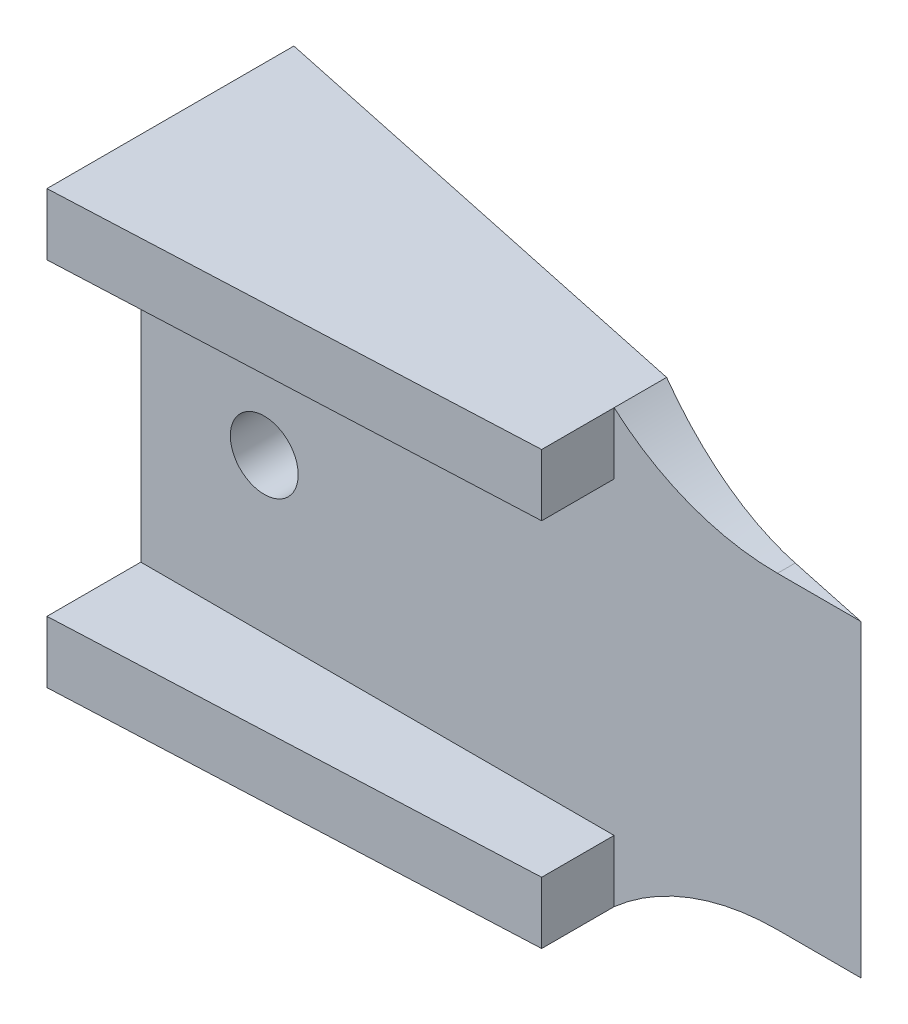
ISO-10303-21;
HEADER;
FILE_DESCRIPTION(('STEP AP214'),'2;1');
FILE_NAME('part.step','',(''),(''),'','','');
FILE_SCHEMA(('AUTOMOTIVE_DESIGN { 1 0 10303 214 1 1 1 1 }'));
ENDSEC;
DATA;
#1=APPLICATION_CONTEXT('core data for automotive mechanical design processes');
#2=APPLICATION_PROTOCOL_DEFINITION('international standard','automotive_design',2000,#1);
#3=PRODUCT_CONTEXT('',#1,'mechanical');
#4=PRODUCT('Part','Part','',(#3));
#5=PRODUCT_RELATED_PRODUCT_CATEGORY('part','',(#4));
#6=PRODUCT_DEFINITION_FORMATION('','',#4);
#7=PRODUCT_DEFINITION_CONTEXT('part definition',#1,'design');
#8=PRODUCT_DEFINITION('design','',#6,#7);
#9=PRODUCT_DEFINITION_SHAPE('','',#8);
#10=(LENGTH_UNIT() NAMED_UNIT(*) SI_UNIT(.MILLI.,.METRE.));
#11=(NAMED_UNIT(*) PLANE_ANGLE_UNIT() SI_UNIT($,.RADIAN.));
#12=(NAMED_UNIT(*) SI_UNIT($,.STERADIAN.) SOLID_ANGLE_UNIT());
#13=UNCERTAINTY_MEASURE_WITH_UNIT(LENGTH_MEASURE(1.E-05),#10,'distance_accuracy_value','');
#14=(GEOMETRIC_REPRESENTATION_CONTEXT(3) GLOBAL_UNCERTAINTY_ASSIGNED_CONTEXT((#13)) GLOBAL_UNIT_ASSIGNED_CONTEXT((#10,
#11,#12)) REPRESENTATION_CONTEXT('',''));
#15=CARTESIAN_POINT('',(0.,0.,0.));
#16=DIRECTION('',(0.,0.,1.));
#17=DIRECTION('',(1.,0.,0.));
#18=AXIS2_PLACEMENT_3D('',#15,#16,#17);
#19=CARTESIAN_POINT('',(0.,0.,0.));
#20=DIRECTION('',(0.,-1.,0.));
#21=DIRECTION('',(0.,0.,-1.));
#22=AXIS2_PLACEMENT_3D('',#19,#20,#21);
#23=PLANE('',#22);
#24=DIRECTION('',(1.,0.,0.));
#25=VECTOR('',#24,1.);
#26=CARTESIAN_POINT('',(0.,0.,0.));
#27=LINE('',#26,#25);
#28=CARTESIAN_POINT('',(30.9372539331938,0.,0.));
#29=VERTEX_POINT('',#28);
#30=CARTESIAN_POINT('',(35.,0.,0.));
#31=VERTEX_POINT('',#30);
#32=EDGE_CURVE('E218',#29,#31,#27,.T.);
#33=ORIENTED_EDGE('',*,*,#32,.F.);
#34=DIRECTION('',(0.,0.,1.));
#35=VECTOR('',#34,1.);
#36=CARTESIAN_POINT('',(30.9372539331938,0.,-2.55067874004027));
#37=LINE('',#36,#35);
#38=CARTESIAN_POINT('',(30.9372539331938,0.,-0.86356333489874));
#39=VERTEX_POINT('',#38);
#40=EDGE_CURVE('E243',#29,#39,#37,.F.);
#41=ORIENTED_EDGE('',*,*,#40,.T.);
#42=DIRECTION('',(-0.978147600733806,0.,-0.20791169081776));
#43=VECTOR('',#42,1.);
#44=CARTESIAN_POINT('',(0.,0.,-7.43947965845079));
#45=LINE('',#44,#43);
#46=EDGE_CURVE('E142',#31,#39,#45,.T.);
#47=ORIENTED_EDGE('',*,*,#46,.F.);
#48=EDGE_LOOP('',(#33,#41,#47));
#49=FACE_BOUND('',#48,.T.);
#50=ADVANCED_FACE('F34',(#49),#23,.T.);
#51=CARTESIAN_POINT('',(0.,15.,0.));
#52=DIRECTION('',(0.,-1.,0.));
#53=DIRECTION('',(0.,0.,-1.));
#54=AXIS2_PLACEMENT_3D('',#51,#52,#53);
#55=PLANE('',#54);
#56=DIRECTION('',(-0.978147600733806,0.,-0.20791169081776));
#57=VECTOR('',#56,1.);
#58=CARTESIAN_POINT('',(0.,15.,-7.43947965845079));
#59=LINE('',#58,#57);
#60=CARTESIAN_POINT('',(35.,15.,0.));
#61=VERTEX_POINT('',#60);
#62=CARTESIAN_POINT('',(30.9372539331938,15.,-0.86356333489874));
#63=VERTEX_POINT('',#62);
#64=EDGE_CURVE('E222',#61,#63,#59,.T.);
#65=ORIENTED_EDGE('',*,*,#64,.T.);
#66=DIRECTION('',(0.,0.,-1.));
#67=VECTOR('',#66,1.);
#68=CARTESIAN_POINT('',(30.9372539331938,15.,0.));
#69=LINE('',#68,#67);
#70=CARTESIAN_POINT('',(30.9372539331938,15.,0.));
#71=VERTEX_POINT('',#70);
#72=EDGE_CURVE('E148',#63,#71,#69,.F.);
#73=ORIENTED_EDGE('',*,*,#72,.T.);
#74=DIRECTION('',(1.,0.,0.));
#75=VECTOR('',#74,1.);
#76=CARTESIAN_POINT('',(0.,15.,0.));
#77=LINE('',#76,#75);
#78=EDGE_CURVE('E223',#71,#61,#77,.T.);
#79=ORIENTED_EDGE('',*,*,#78,.T.);
#80=EDGE_LOOP('',(#65,#73,#79));
#81=FACE_BOUND('',#80,.T.);
#82=ADVANCED_FACE('F254',(#81),#55,.F.);
#83=CARTESIAN_POINT('',(0.,15.,0.));
#84=DIRECTION('',(1.,0.,0.));
#85=DIRECTION('',(0.,0.,-1.));
#86=AXIS2_PLACEMENT_3D('',#83,#84,#85);
#87=PLANE('',#86);
#88=DIRECTION('',(0.,0.,-1.));
#89=VECTOR('',#88,1.);
#90=CARTESIAN_POINT('',(0.,5.,-4.43947965845079));
#91=LINE('',#90,#89);
#92=CARTESIAN_POINT('',(0.,5.,-7.43947965845079));
#93=VERTEX_POINT('',#92);
#94=CARTESIAN_POINT('',(0.,5.,-4.43947965845079));
#95=VERTEX_POINT('',#94);
#96=EDGE_CURVE('E216',#93,#95,#91,.F.);
#97=ORIENTED_EDGE('',*,*,#96,.F.);
#98=DIRECTION('',(0.,-1.,0.));
#99=VECTOR('',#98,1.);
#100=CARTESIAN_POINT('',(0.,15.,-7.43947965845079));
#101=LINE('',#100,#99);
#102=CARTESIAN_POINT('',(0.,-3.,-7.43947965845079));
#103=VERTEX_POINT('',#102);
#104=EDGE_CURVE('E225',#93,#103,#101,.T.);
#105=ORIENTED_EDGE('',*,*,#104,.T.);
#106=DIRECTION('',(0.,0.,1.));
#107=VECTOR('',#106,1.);
#108=CARTESIAN_POINT('',(0.,-3.,-7.43947965845079));
#109=LINE('',#108,#107);
#110=CARTESIAN_POINT('',(0.,-3.,4.56052034154921));
#111=VERTEX_POINT('',#110);
#112=EDGE_CURVE('E158',#103,#111,#109,.T.);
#113=ORIENTED_EDGE('',*,*,#112,.T.);
#114=DIRECTION('',(0.,1.,0.));
#115=VECTOR('',#114,1.);
#116=CARTESIAN_POINT('',(0.,-3.,4.56052034154921));
#117=LINE('',#116,#115);
#118=CARTESIAN_POINT('',(0.,0.,4.56052034154921));
#119=VERTEX_POINT('',#118);
#120=EDGE_CURVE('E170',#111,#119,#117,.T.);
#121=ORIENTED_EDGE('',*,*,#120,.T.);
#122=DIRECTION('',(0.,0.,1.));
#123=VECTOR('',#122,1.);
#124=CARTESIAN_POINT('',(0.,0.,-7.43947965845079));
#125=LINE('',#124,#123);
#126=CARTESIAN_POINT('',(0.,0.,0.));
#127=VERTEX_POINT('',#126);
#128=EDGE_CURVE('E159',#127,#119,#125,.T.);
#129=ORIENTED_EDGE('',*,*,#128,.F.);
#130=DIRECTION('',(0.,-1.,0.));
#131=VECTOR('',#130,1.);
#132=CARTESIAN_POINT('',(0.,15.,0.));
#133=LINE('',#132,#131);
#134=CARTESIAN_POINT('',(0.,15.,0.));
#135=VERTEX_POINT('',#134);
#136=EDGE_CURVE('E235',#135,#127,#133,.T.);
#137=ORIENTED_EDGE('',*,*,#136,.F.);
#138=DIRECTION('',(0.,0.,1.));
#139=VECTOR('',#138,1.);
#140=CARTESIAN_POINT('',(0.,15.,-7.43947965845079));
#141=LINE('',#140,#139);
#142=CARTESIAN_POINT('',(0.,15.,4.56052034154921));
#143=VERTEX_POINT('',#142);
#144=EDGE_CURVE('E182',#135,#143,#141,.T.);
#145=ORIENTED_EDGE('',*,*,#144,.T.);
#146=DIRECTION('',(0.,-1.,0.));
#147=VECTOR('',#146,1.);
#148=CARTESIAN_POINT('',(0.,18.,4.56052034154921));
#149=LINE('',#148,#147);
#150=CARTESIAN_POINT('',(0.,18.,4.56052034154921));
#151=VERTEX_POINT('',#150);
#152=EDGE_CURVE('E202',#151,#143,#149,.T.);
#153=ORIENTED_EDGE('',*,*,#152,.F.);
#154=DIRECTION('',(0.,0.,1.));
#155=VECTOR('',#154,1.);
#156=CARTESIAN_POINT('',(0.,18.,-7.43947965845079));
#157=LINE('',#156,#155);
#158=CARTESIAN_POINT('',(0.,18.,-7.43947965845079));
#159=VERTEX_POINT('',#158);
#160=EDGE_CURVE('E186',#159,#151,#157,.T.);
#161=ORIENTED_EDGE('',*,*,#160,.F.);
#162=CARTESIAN_POINT('',(0.,10.,-7.43947965845079));
#163=VERTEX_POINT('',#162);
#164=EDGE_CURVE('E230',#159,#163,#101,.T.);
#165=ORIENTED_EDGE('',*,*,#164,.T.);
#166=DIRECTION('',(0.,0.,-1.));
#167=VECTOR('',#166,1.);
#168=CARTESIAN_POINT('',(0.,10.,-4.43947965845079));
#169=LINE('',#168,#167);
#170=CARTESIAN_POINT('',(0.,10.,-4.43947965845079));
#171=VERTEX_POINT('',#170);
#172=EDGE_CURVE('E214',#171,#163,#169,.T.);
#173=ORIENTED_EDGE('',*,*,#172,.F.);
#174=DIRECTION('',(0.,-1.,0.));
#175=VECTOR('',#174,1.);
#176=CARTESIAN_POINT('',(0.,15.,-4.43947965845079));
#177=LINE('',#176,#175);
#178=EDGE_CURVE('E240',#171,#95,#177,.T.);
#179=ORIENTED_EDGE('',*,*,#178,.T.);
#180=EDGE_LOOP('',(#97,#105,#113,#121,#129,#137,#145,#153,#161,#165,#173,#179));
#181=FACE_BOUND('',#180,.T.);
#182=ADVANCED_FACE('F259',(#181),#87,.F.);
#183=CARTESIAN_POINT('',(0.,15.,-7.43947965845079));
#184=DIRECTION('',(-0.20791169081776,0.,0.978147600733805));
#185=DIRECTION('',(0.978147600733806,0.,0.20791169081776));
#186=AXIS2_PLACEMENT_3D('',#183,#184,#185);
#187=PLANE('',#186);
#188=CARTESIAN_POINT('',(6.,7.5,-6.16414028843066));
#189=DIRECTION('',(-0.20791169081776,0.,0.978147600733805));
#190=DIRECTION('',(-0.978147600733806,0.,-0.20791169081776));
#191=AXIS2_PLACEMENT_3D('',#188,#189,#190);
#192=ELLIPSE('',#191,6.64521386662269,6.5);
#193=EDGE_CURVE('E238',#163,#93,#192,.F.);
#194=ORIENTED_EDGE('',*,*,#193,.F.);
#195=ORIENTED_EDGE('',*,*,#164,.F.);
#196=DIRECTION('',(-0.978147600733805,0.,-0.20791169081776));
#197=VECTOR('',#196,1.);
#198=CARTESIAN_POINT('',(23.,18.,-2.55067874004027));
#199=LINE('',#198,#197);
#200=CARTESIAN_POINT('',(23.,18.,-2.55067874004027));
#201=VERTEX_POINT('',#200);
#202=EDGE_CURVE('E183',#201,#159,#199,.T.);
#203=ORIENTED_EDGE('',*,*,#202,.F.);
#204=CARTESIAN_POINT('',(30.9372539331938,27.,-0.863563334898743));
#205=DIRECTION('',(-0.20791169081776,0.,0.978147600733805));
#206=DIRECTION('',(-0.978147600733806,0.,-0.20791169081776));
#207=AXIS2_PLACEMENT_3D('',#204,#205,#206);
#208=ELLIPSE('',#207,12.2680871383804,12.);
#209=EDGE_CURVE('E42',#201,#63,#208,.T.);
#210=ORIENTED_EDGE('',*,*,#209,.T.);
#211=ORIENTED_EDGE('',*,*,#64,.F.);
#212=DIRECTION('',(0.,-1.,0.));
#213=VECTOR('',#212,1.);
#214=CARTESIAN_POINT('',(35.,15.,0.));
#215=LINE('',#214,#213);
#216=EDGE_CURVE('E233',#61,#31,#215,.T.);
#217=ORIENTED_EDGE('',*,*,#216,.T.);
#218=ORIENTED_EDGE('',*,*,#46,.T.);
#219=CARTESIAN_POINT('',(30.9372539331938,-12.,-0.863563334898743));
#220=DIRECTION('',(-0.20791169081776,0.,0.978147600733805));
#221=DIRECTION('',(-0.978147600733806,0.,-0.20791169081776));
#222=AXIS2_PLACEMENT_3D('',#219,#220,#221);
#223=ELLIPSE('',#222,12.2680871383804,12.);
#224=CARTESIAN_POINT('',(23.,-3.,-2.55067874004027));
#225=VERTEX_POINT('',#224);
#226=EDGE_CURVE('E133',#39,#225,#223,.T.);
#227=ORIENTED_EDGE('',*,*,#226,.T.);
#228=DIRECTION('',(-0.978147600733805,0.,-0.20791169081776));
#229=VECTOR('',#228,1.);
#230=CARTESIAN_POINT('',(23.,-3.,-2.55067874004027));
#231=LINE('',#230,#229);
#232=EDGE_CURVE('E138',#225,#103,#231,.T.);
#233=ORIENTED_EDGE('',*,*,#232,.T.);
#234=ORIENTED_EDGE('',*,*,#104,.F.);
#235=EDGE_LOOP('',(#194,#195,#203,#210,#211,#217,#218,#227,#233,#234));
#236=FACE_BOUND('',#235,.T.);
#237=ADVANCED_FACE('F136',(#236),#187,.F.);
#238=CARTESIAN_POINT('',(0.,15.,0.));
#239=DIRECTION('',(0.,0.,-1.));
#240=DIRECTION('',(-1.,0.,0.));
#241=AXIS2_PLACEMENT_3D('',#238,#239,#240);
#242=PLANE('',#241);
#243=CARTESIAN_POINT('',(6.,7.5,0.));
#244=DIRECTION('',(0.,0.,-1.));
#245=DIRECTION('',(-1.,0.,0.));
#246=AXIS2_PLACEMENT_3D('',#243,#244,#245);
#247=CIRCLE('',#246,1.65);
#248=CARTESIAN_POINT('',(4.35,7.5,0.));
#249=VERTEX_POINT('',#248);
#250=EDGE_CURVE('E206',#249,#249,#247,.T.);
#251=ORIENTED_EDGE('',*,*,#250,.T.);
#252=EDGE_LOOP('',(#251));
#253=FACE_BOUND('',#252,.T.);
#254=CARTESIAN_POINT('',(23.,0.,0.));
#255=VERTEX_POINT('',#254);
#256=EDGE_CURVE('E226',#127,#255,#27,.T.);
#257=ORIENTED_EDGE('',*,*,#256,.T.);
#258=DIRECTION('',(0.,1.,0.));
#259=VECTOR('',#258,1.);
#260=CARTESIAN_POINT('',(23.,-3.,0.));
#261=LINE('',#260,#259);
#262=CARTESIAN_POINT('',(23.,-3.,0.));
#263=VERTEX_POINT('',#262);
#264=EDGE_CURVE('E245',#263,#255,#261,.T.);
#265=ORIENTED_EDGE('',*,*,#264,.F.);
#266=CARTESIAN_POINT('',(30.9372539331938,-12.,0.));
#267=DIRECTION('',(0.,0.,-1.));
#268=DIRECTION('',(-1.,0.,0.));
#269=AXIS2_PLACEMENT_3D('',#266,#267,#268);
#270=CIRCLE('',#269,12.);
#271=EDGE_CURVE('E147',#263,#29,#270,.T.);
#272=ORIENTED_EDGE('',*,*,#271,.T.);
#273=ORIENTED_EDGE('',*,*,#32,.T.);
#274=ORIENTED_EDGE('',*,*,#216,.F.);
#275=ORIENTED_EDGE('',*,*,#78,.F.);
#276=CARTESIAN_POINT('',(30.9372539331938,27.,0.));
#277=DIRECTION('',(0.,0.,-1.));
#278=DIRECTION('',(-1.,0.,0.));
#279=AXIS2_PLACEMENT_3D('',#276,#277,#278);
#280=CIRCLE('',#279,12.);
#281=CARTESIAN_POINT('',(23.,18.,0.));
#282=VERTEX_POINT('',#281);
#283=EDGE_CURVE('E11',#71,#282,#280,.T.);
#284=ORIENTED_EDGE('',*,*,#283,.T.);
#285=DIRECTION('',(0.,1.,0.));
#286=VECTOR('',#285,1.);
#287=CARTESIAN_POINT('',(23.,15.,0.));
#288=LINE('',#287,#286);
#289=CARTESIAN_POINT('',(23.,15.,0.));
#290=VERTEX_POINT('',#289);
#291=EDGE_CURVE('E48',#290,#282,#288,.T.);
#292=ORIENTED_EDGE('',*,*,#291,.F.);
#293=EDGE_CURVE('E219',#135,#290,#77,.T.);
#294=ORIENTED_EDGE('',*,*,#293,.F.);
#295=ORIENTED_EDGE('',*,*,#136,.T.);
#296=EDGE_LOOP('',(#257,#265,#272,#273,#274,#275,#284,#292,#294,#295));
#297=FACE_BOUND('',#296,.T.);
#298=ADVANCED_FACE('F250',(#253,#297),#242,.F.);
#299=CARTESIAN_POINT('',(6.,7.5,-4.43947965845079));
#300=DIRECTION('',(0.,0.,1.));
#301=DIRECTION('',(1.,0.,0.));
#302=AXIS2_PLACEMENT_3D('',#299,#300,#301);
#303=PLANE('',#302);
#304=CARTESIAN_POINT('',(6.,7.5,-4.43947965845079));
#305=DIRECTION('',(0.,0.,-1.));
#306=DIRECTION('',(-1.,0.,0.));
#307=AXIS2_PLACEMENT_3D('',#304,#305,#306);
#308=CIRCLE('',#307,1.65);
#309=CARTESIAN_POINT('',(4.35,7.5,-4.43947965845079));
#310=VERTEX_POINT('',#309);
#311=EDGE_CURVE('E205',#310,#310,#308,.T.);
#312=ORIENTED_EDGE('',*,*,#311,.F.);
#313=EDGE_LOOP('',(#312));
#314=FACE_BOUND('',#313,.T.);
#315=CARTESIAN_POINT('',(6.,7.5,-4.43947965845079));
#316=DIRECTION('',(0.,0.,1.));
#317=DIRECTION('',(1.,0.,0.));
#318=AXIS2_PLACEMENT_3D('',#315,#316,#317);
#319=CIRCLE('',#318,6.5);
#320=EDGE_CURVE('E209',#95,#171,#319,.T.);
#321=ORIENTED_EDGE('',*,*,#320,.F.);
#322=ORIENTED_EDGE('',*,*,#178,.F.);
#323=EDGE_LOOP('',(#321,#322));
#324=FACE_BOUND('',#323,.T.);
#325=ADVANCED_FACE('F268',(#314,#324),#303,.F.);
#326=CARTESIAN_POINT('',(6.,7.5,-4.43947965845079));
#327=DIRECTION('',(0.,0.,-1.));
#328=DIRECTION('',(-1.,0.,0.));
#329=AXIS2_PLACEMENT_3D('',#326,#327,#328);
#330=CYLINDRICAL_SURFACE('',#329,6.5);
#331=ORIENTED_EDGE('',*,*,#96,.T.);
#332=ORIENTED_EDGE('',*,*,#320,.T.);
#333=ORIENTED_EDGE('',*,*,#172,.T.);
#334=ORIENTED_EDGE('',*,*,#193,.T.);
#335=EDGE_LOOP('',(#331,#332,#333,#334));
#336=FACE_BOUND('',#335,.T.);
#337=ADVANCED_FACE('F313',(#336),#330,.F.);
#338=CARTESIAN_POINT('',(6.,7.5,0.));
#339=DIRECTION('',(0.,0.,-1.));
#340=DIRECTION('',(-1.,0.,0.));
#341=AXIS2_PLACEMENT_3D('',#338,#339,#340);
#342=CYLINDRICAL_SURFACE('',#341,1.65);
#343=ORIENTED_EDGE('',*,*,#250,.F.);
#344=EDGE_LOOP('',(#343));
#345=FACE_BOUND('',#344,.T.);
#346=ORIENTED_EDGE('',*,*,#311,.T.);
#347=EDGE_LOOP('',(#346));
#348=FACE_BOUND('',#347,.T.);
#349=ADVANCED_FACE('F303',(#345,#348),#342,.F.);
#350=CARTESIAN_POINT('',(0.,15.,0.));
#351=DIRECTION('',(0.,1.,0.));
#352=DIRECTION('',(0.,0.,1.));
#353=AXIS2_PLACEMENT_3D('',#350,#351,#352);
#354=PLANE('',#353);
#355=ORIENTED_EDGE('',*,*,#144,.F.);
#356=ORIENTED_EDGE('',*,*,#293,.T.);
#357=DIRECTION('',(0.,0.,-1.));
#358=VECTOR('',#357,1.);
#359=CARTESIAN_POINT('',(23.,15.,3.52049520218145));
#360=LINE('',#359,#358);
#361=CARTESIAN_POINT('',(23.,15.,3.52049520218145));
#362=VERTEX_POINT('',#361);
#363=EDGE_CURVE('E187',#362,#290,#360,.T.);
#364=ORIENTED_EDGE('',*,*,#363,.F.);
#365=DIRECTION('',(0.998979209487863,0.,-0.0451723257205697));
#366=VECTOR('',#365,1.);
#367=CARTESIAN_POINT('',(0.,15.,4.56052034154921));
#368=LINE('',#367,#366);
#369=EDGE_CURVE('E197',#143,#362,#368,.T.);
#370=ORIENTED_EDGE('',*,*,#369,.F.);
#371=EDGE_LOOP('',(#355,#356,#364,#370));
#372=FACE_BOUND('',#371,.T.);
#373=ADVANCED_FACE('F299',(#372),#354,.F.);
#374=CARTESIAN_POINT('',(0.,18.,4.56052034154921));
#375=DIRECTION('',(-0.0451723257205697,0.,-0.998979209487862));
#376=DIRECTION('',(-0.998979209487863,0.,0.0451723257205697));
#377=AXIS2_PLACEMENT_3D('',#374,#375,#376);
#378=PLANE('',#377);
#379=ORIENTED_EDGE('',*,*,#369,.T.);
#380=DIRECTION('',(0.,-1.,0.));
#381=VECTOR('',#380,1.);
#382=CARTESIAN_POINT('',(23.,18.,3.52049520218145));
#383=LINE('',#382,#381);
#384=CARTESIAN_POINT('',(23.,18.,3.52049520218145));
#385=VERTEX_POINT('',#384);
#386=EDGE_CURVE('E195',#385,#362,#383,.T.);
#387=ORIENTED_EDGE('',*,*,#386,.F.);
#388=DIRECTION('',(0.998979209487863,0.,-0.0451723257205697));
#389=VECTOR('',#388,1.);
#390=CARTESIAN_POINT('',(0.,18.,4.56052034154921));
#391=LINE('',#390,#389);
#392=EDGE_CURVE('E189',#151,#385,#391,.T.);
#393=ORIENTED_EDGE('',*,*,#392,.F.);
#394=ORIENTED_EDGE('',*,*,#152,.T.);
#395=EDGE_LOOP('',(#379,#387,#393,#394));
#396=FACE_BOUND('',#395,.T.);
#397=ADVANCED_FACE('F302',(#396),#378,.F.);
#398=CARTESIAN_POINT('',(23.,18.,3.52049520218145));
#399=DIRECTION('',(-1.,0.,0.));
#400=DIRECTION('',(0.,0.,1.));
#401=AXIS2_PLACEMENT_3D('',#398,#399,#400);
#402=PLANE('',#401);
#403=ORIENTED_EDGE('',*,*,#363,.T.);
#404=ORIENTED_EDGE('',*,*,#291,.T.);
#405=DIRECTION('',(0.,0.,-1.));
#406=VECTOR('',#405,1.);
#407=CARTESIAN_POINT('',(23.,18.,3.52049520218145));
#408=LINE('',#407,#406);
#409=EDGE_CURVE('E192',#385,#282,#408,.T.);
#410=ORIENTED_EDGE('',*,*,#409,.F.);
#411=ORIENTED_EDGE('',*,*,#386,.T.);
#412=EDGE_LOOP('',(#403,#404,#410,#411));
#413=FACE_BOUND('',#412,.T.);
#414=ADVANCED_FACE('F297',(#413),#402,.F.);
#415=CARTESIAN_POINT('',(0.,18.,0.));
#416=DIRECTION('',(0.,1.,0.));
#417=DIRECTION('',(0.,0.,1.));
#418=AXIS2_PLACEMENT_3D('',#415,#416,#417);
#419=PLANE('',#418);
#420=ORIENTED_EDGE('',*,*,#202,.T.);
#421=ORIENTED_EDGE('',*,*,#160,.T.);
#422=ORIENTED_EDGE('',*,*,#392,.T.);
#423=ORIENTED_EDGE('',*,*,#409,.T.);
#424=EDGE_CURVE('E191',#282,#201,#408,.T.);
#425=ORIENTED_EDGE('',*,*,#424,.T.);
#426=EDGE_LOOP('',(#420,#421,#422,#423,#425));
#427=FACE_BOUND('',#426,.T.);
#428=ADVANCED_FACE('F293',(#427),#419,.T.);
#429=CARTESIAN_POINT('',(23.,-3.,3.52049520218145));
#430=DIRECTION('',(1.,0.,0.));
#431=DIRECTION('',(0.,0.,-1.));
#432=AXIS2_PLACEMENT_3D('',#429,#430,#431);
#433=PLANE('',#432);
#434=DIRECTION('',(0.,0.,-1.));
#435=VECTOR('',#434,1.);
#436=CARTESIAN_POINT('',(23.,-3.,3.52049520218145));
#437=LINE('',#436,#435);
#438=CARTESIAN_POINT('',(23.,-3.,3.52049520218145));
#439=VERTEX_POINT('',#438);
#440=EDGE_CURVE('E163',#439,#263,#437,.T.);
#441=ORIENTED_EDGE('',*,*,#440,.T.);
#442=ORIENTED_EDGE('',*,*,#264,.T.);
#443=DIRECTION('',(0.,0.,-1.));
#444=VECTOR('',#443,1.);
#445=CARTESIAN_POINT('',(23.,0.,3.52049520218145));
#446=LINE('',#445,#444);
#447=CARTESIAN_POINT('',(23.,0.,3.52049520218145));
#448=VERTEX_POINT('',#447);
#449=EDGE_CURVE('E171',#448,#255,#446,.T.);
#450=ORIENTED_EDGE('',*,*,#449,.F.);
#451=DIRECTION('',(0.,1.,0.));
#452=VECTOR('',#451,1.);
#453=CARTESIAN_POINT('',(23.,-3.,3.52049520218145));
#454=LINE('',#453,#452);
#455=EDGE_CURVE('E180',#439,#448,#454,.T.);
#456=ORIENTED_EDGE('',*,*,#455,.F.);
#457=EDGE_LOOP('',(#441,#442,#450,#456));
#458=FACE_BOUND('',#457,.T.);
#459=ADVANCED_FACE('F289',(#458),#433,.T.);
#460=CARTESIAN_POINT('',(0.,-3.,4.56052034154921));
#461=DIRECTION('',(0.0451723257205697,0.,0.998979209487862));
#462=DIRECTION('',(0.998979209487863,0.,-0.0451723257205697));
#463=AXIS2_PLACEMENT_3D('',#460,#461,#462);
#464=PLANE('',#463);
#465=DIRECTION('',(0.998979209487863,0.,-0.0451723257205697));
#466=VECTOR('',#465,1.);
#467=CARTESIAN_POINT('',(0.,0.,4.56052034154921));
#468=LINE('',#467,#466);
#469=EDGE_CURVE('E174',#119,#448,#468,.T.);
#470=ORIENTED_EDGE('',*,*,#469,.F.);
#471=ORIENTED_EDGE('',*,*,#120,.F.);
#472=DIRECTION('',(0.998979209487863,0.,-0.0451723257205697));
#473=VECTOR('',#472,1.);
#474=CARTESIAN_POINT('',(0.,-3.,4.56052034154921));
#475=LINE('',#474,#473);
#476=EDGE_CURVE('E165',#111,#439,#475,.T.);
#477=ORIENTED_EDGE('',*,*,#476,.T.);
#478=ORIENTED_EDGE('',*,*,#455,.T.);
#479=EDGE_LOOP('',(#470,#471,#477,#478));
#480=FACE_BOUND('',#479,.T.);
#481=ADVANCED_FACE('F284',(#480),#464,.T.);
#482=CARTESIAN_POINT('',(0.,-3.,0.));
#483=DIRECTION('',(0.,-1.,0.));
#484=DIRECTION('',(0.,0.,1.));
#485=AXIS2_PLACEMENT_3D('',#482,#483,#484);
#486=PLANE('',#485);
#487=ORIENTED_EDGE('',*,*,#232,.F.);
#488=EDGE_CURVE('E154',#263,#225,#437,.T.);
#489=ORIENTED_EDGE('',*,*,#488,.F.);
#490=ORIENTED_EDGE('',*,*,#440,.F.);
#491=ORIENTED_EDGE('',*,*,#476,.F.);
#492=ORIENTED_EDGE('',*,*,#112,.F.);
#493=EDGE_LOOP('',(#487,#489,#490,#491,#492));
#494=FACE_BOUND('',#493,.T.);
#495=ADVANCED_FACE('F152',(#494),#486,.T.);
#496=CARTESIAN_POINT('',(0.,0.,0.));
#497=DIRECTION('',(0.,-1.,0.));
#498=DIRECTION('',(0.,0.,1.));
#499=AXIS2_PLACEMENT_3D('',#496,#497,#498);
#500=PLANE('',#499);
#501=ORIENTED_EDGE('',*,*,#256,.F.);
#502=ORIENTED_EDGE('',*,*,#128,.T.);
#503=ORIENTED_EDGE('',*,*,#469,.T.);
#504=ORIENTED_EDGE('',*,*,#449,.T.);
#505=EDGE_LOOP('',(#501,#502,#503,#504));
#506=FACE_BOUND('',#505,.T.);
#507=ADVANCED_FACE('F273',(#506),#500,.F.);
#508=CARTESIAN_POINT('',(30.9372539331938,-12.,3.52049520218145));
#509=DIRECTION('',(0.,0.,-1.));
#510=DIRECTION('',(-1.,0.,0.));
#511=AXIS2_PLACEMENT_3D('',#508,#509,#510);
#512=CYLINDRICAL_SURFACE('',#511,12.);
#513=ORIENTED_EDGE('',*,*,#271,.F.);
#514=ORIENTED_EDGE('',*,*,#488,.T.);
#515=ORIENTED_EDGE('',*,*,#226,.F.);
#516=ORIENTED_EDGE('',*,*,#40,.F.);
#517=EDGE_LOOP('',(#513,#514,#515,#516));
#518=FACE_BOUND('',#517,.T.);
#519=ADVANCED_FACE('F162',(#518),#512,.F.);
#520=CARTESIAN_POINT('',(30.9372539331938,27.,3.52049520218145));
#521=DIRECTION('',(0.,0.,-1.));
#522=DIRECTION('',(-1.,0.,0.));
#523=AXIS2_PLACEMENT_3D('',#520,#521,#522);
#524=CYLINDRICAL_SURFACE('',#523,12.);
#525=ORIENTED_EDGE('',*,*,#283,.F.);
#526=ORIENTED_EDGE('',*,*,#72,.F.);
#527=ORIENTED_EDGE('',*,*,#209,.F.);
#528=ORIENTED_EDGE('',*,*,#424,.F.);
#529=EDGE_LOOP('',(#525,#526,#527,#528));
#530=FACE_BOUND('',#529,.T.);
#531=ADVANCED_FACE('F36',(#530),#524,.F.);
#532=CLOSED_SHELL('',(#50,#82,#182,#237,#298,#325,#337,#349,#373,#397,#414,#428,#459,#481,#495,
#507,#519,#531));
#533=MANIFOLD_SOLID_BREP('B2',#532);
#534=ADVANCED_BREP_SHAPE_REPRESENTATION('',(#18,#533),#14);
#535=SHAPE_DEFINITION_REPRESENTATION(#9,#534);
ENDSEC;
END-ISO-10303-21;
